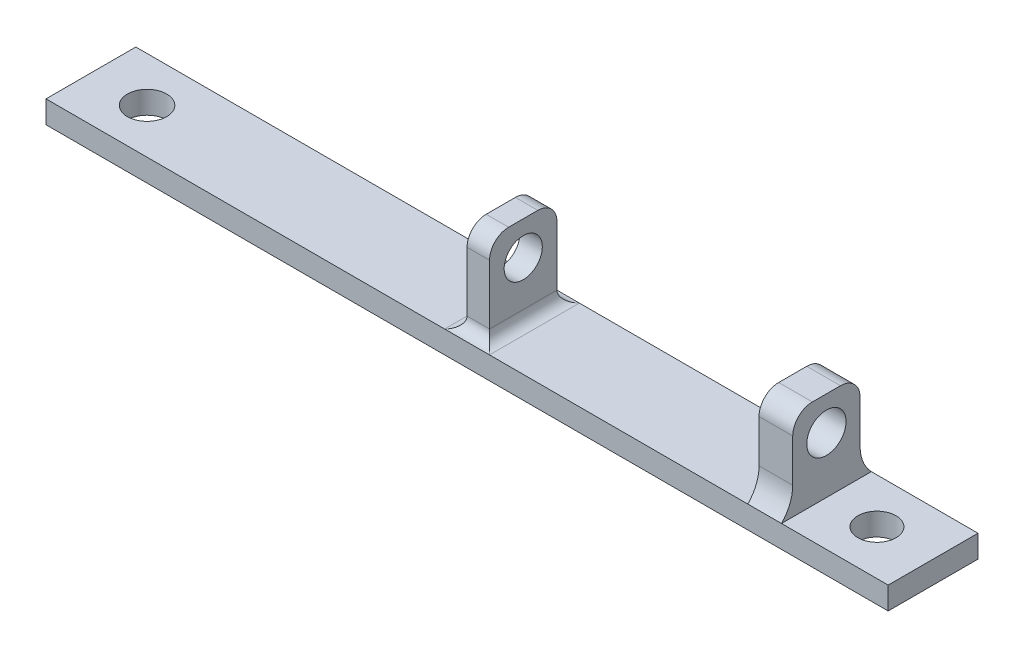
ISO-10303-21;
HEADER;
FILE_DESCRIPTION(('STEP AP214'),'2;1');
FILE_NAME('part.step','',(''),(''),'','','');
FILE_SCHEMA(('AUTOMOTIVE_DESIGN { 1 0 10303 214 1 1 1 1 }'));
ENDSEC;
DATA;
#1=APPLICATION_CONTEXT('core data for automotive mechanical design processes');
#2=APPLICATION_PROTOCOL_DEFINITION('international standard','automotive_design',2000,#1);
#3=PRODUCT_CONTEXT('',#1,'mechanical');
#4=PRODUCT('Part','Part','',(#3));
#5=PRODUCT_RELATED_PRODUCT_CATEGORY('part','',(#4));
#6=PRODUCT_DEFINITION_FORMATION('','',#4);
#7=PRODUCT_DEFINITION_CONTEXT('part definition',#1,'design');
#8=PRODUCT_DEFINITION('design','',#6,#7);
#9=PRODUCT_DEFINITION_SHAPE('','',#8);
#10=(LENGTH_UNIT() NAMED_UNIT(*) SI_UNIT(.MILLI.,.METRE.));
#11=(NAMED_UNIT(*) PLANE_ANGLE_UNIT() SI_UNIT($,.RADIAN.));
#12=(NAMED_UNIT(*) SI_UNIT($,.STERADIAN.) SOLID_ANGLE_UNIT());
#13=UNCERTAINTY_MEASURE_WITH_UNIT(LENGTH_MEASURE(1.E-05),#10,'distance_accuracy_value','');
#14=(GEOMETRIC_REPRESENTATION_CONTEXT(3) GLOBAL_UNCERTAINTY_ASSIGNED_CONTEXT((#13)) GLOBAL_UNIT_ASSIGNED_CONTEXT((#10,
#11,#12)) REPRESENTATION_CONTEXT('',''));
#15=CARTESIAN_POINT('',(0.,0.,0.));
#16=DIRECTION('',(0.,0.,1.));
#17=DIRECTION('',(1.,0.,0.));
#18=AXIS2_PLACEMENT_3D('',#15,#16,#17);
#19=CARTESIAN_POINT('',(0.,2.,0.));
#20=DIRECTION('',(0.,1.,0.));
#21=DIRECTION('',(0.,0.,1.));
#22=AXIS2_PLACEMENT_3D('',#19,#20,#21);
#23=PLANE('',#22);
#24=CARTESIAN_POINT('',(32.5,2.,0.));
#25=DIRECTION('',(0.,1.,0.));
#26=DIRECTION('',(0.,0.,1.));
#27=AXIS2_PLACEMENT_3D('',#24,#25,#26);
#28=CIRCLE('',#27,1.7);
#29=CARTESIAN_POINT('',(32.5,2.,1.7));
#30=VERTEX_POINT('',#29);
#31=EDGE_CURVE('E389',#30,#30,#28,.T.);
#32=ORIENTED_EDGE('',*,*,#31,.F.);
#33=EDGE_LOOP('',(#32));
#34=FACE_BOUND('',#33,.T.);
#35=DIRECTION('',(-1.,0.,0.));
#36=VECTOR('',#35,1.);
#37=CARTESIAN_POINT('',(-37.5,2.,-4.));
#38=LINE('',#37,#36);
#39=CARTESIAN_POINT('',(37.5,2.,-4.));
#40=VERTEX_POINT('',#39);
#41=CARTESIAN_POINT('',(28.,2.,-4.));
#42=VERTEX_POINT('',#41);
#43=EDGE_CURVE('E182',#40,#42,#38,.T.);
#44=ORIENTED_EDGE('',*,*,#43,.T.);
#45=DIRECTION('',(0.,0.,-1.));
#46=VECTOR('',#45,1.);
#47=CARTESIAN_POINT('',(28.,2.,3.));
#48=LINE('',#47,#46);
#49=CARTESIAN_POINT('',(28.,2.,4.));
#50=VERTEX_POINT('',#49);
#51=EDGE_CURVE('E327',#50,#42,#48,.T.);
#52=ORIENTED_EDGE('',*,*,#51,.F.);
#53=DIRECTION('',(1.,0.,0.));
#54=VECTOR('',#53,1.);
#55=CARTESIAN_POINT('',(-37.5,2.,4.));
#56=LINE('',#55,#54);
#57=CARTESIAN_POINT('',(37.5,2.,4.));
#58=VERTEX_POINT('',#57);
#59=EDGE_CURVE('E200',#50,#58,#56,.T.);
#60=ORIENTED_EDGE('',*,*,#59,.T.);
#61=DIRECTION('',(0.,0.,-1.));
#62=VECTOR('',#61,1.);
#63=CARTESIAN_POINT('',(37.5,2.,-4.));
#64=LINE('',#63,#62);
#65=EDGE_CURVE('E198',#58,#40,#64,.T.);
#66=ORIENTED_EDGE('',*,*,#65,.T.);
#67=EDGE_LOOP('',(#44,#52,#60,#66));
#68=FACE_BOUND('',#67,.T.);
#69=ADVANCED_FACE('F43',(#34,#68),#23,.T.);
#70=DIRECTION('',(0.,0.,-1.));
#71=VECTOR('',#70,1.);
#72=CARTESIAN_POINT('',(25.,2.,3.));
#73=LINE('',#72,#71);
#74=CARTESIAN_POINT('',(25.,2.,4.));
#75=VERTEX_POINT('',#74);
#76=CARTESIAN_POINT('',(25.,2.,-4.));
#77=VERTEX_POINT('',#76);
#78=EDGE_CURVE('E247',#75,#77,#73,.T.);
#79=ORIENTED_EDGE('',*,*,#78,.T.);
#80=CARTESIAN_POINT('',(2.,2.,-4.));
#81=VERTEX_POINT('',#80);
#82=EDGE_CURVE('E195',#77,#81,#38,.T.);
#83=ORIENTED_EDGE('',*,*,#82,.T.);
#84=DIRECTION('',(0.,0.,-1.));
#85=VECTOR('',#84,1.);
#86=CARTESIAN_POINT('',(2.,2.,3.));
#87=LINE('',#86,#85);
#88=CARTESIAN_POINT('',(2.,2.,4.));
#89=VERTEX_POINT('',#88);
#90=EDGE_CURVE('E217',#81,#89,#87,.F.);
#91=ORIENTED_EDGE('',*,*,#90,.T.);
#92=EDGE_CURVE('E342',#89,#75,#56,.T.);
#93=ORIENTED_EDGE('',*,*,#92,.T.);
#94=EDGE_LOOP('',(#79,#83,#91,#93));
#95=FACE_BOUND('',#94,.T.);
#96=ADVANCED_FACE('F476',(#95),#23,.T.);
#97=CARTESIAN_POINT('',(-32.5,2.,0.));
#98=DIRECTION('',(0.,1.,0.));
#99=DIRECTION('',(0.,0.,1.));
#100=AXIS2_PLACEMENT_3D('',#97,#98,#99);
#101=CIRCLE('',#100,1.75);
#102=CARTESIAN_POINT('',(-32.5,2.,1.75));
#103=VERTEX_POINT('',#102);
#104=EDGE_CURVE('E352',#103,#103,#101,.T.);
#105=ORIENTED_EDGE('',*,*,#104,.F.);
#106=EDGE_LOOP('',(#105));
#107=FACE_BOUND('',#106,.T.);
#108=CARTESIAN_POINT('',(-37.5,2.,4.));
#109=VERTEX_POINT('',#108);
#110=CARTESIAN_POINT('',(-2.,2.,4.));
#111=VERTEX_POINT('',#110);
#112=EDGE_CURVE('E340',#109,#111,#56,.T.);
#113=ORIENTED_EDGE('',*,*,#112,.T.);
#114=DIRECTION('',(0.,0.,-1.));
#115=VECTOR('',#114,1.);
#116=CARTESIAN_POINT('',(-2.,2.,0.));
#117=LINE('',#116,#115);
#118=CARTESIAN_POINT('',(-2.,2.,-4.));
#119=VERTEX_POINT('',#118);
#120=EDGE_CURVE('E212',#111,#119,#117,.T.);
#121=ORIENTED_EDGE('',*,*,#120,.T.);
#122=CARTESIAN_POINT('',(-37.5,2.,-4.));
#123=VERTEX_POINT('',#122);
#124=EDGE_CURVE('E205',#119,#123,#38,.T.);
#125=ORIENTED_EDGE('',*,*,#124,.T.);
#126=DIRECTION('',(0.,0.,1.));
#127=VECTOR('',#126,1.);
#128=CARTESIAN_POINT('',(-37.5,2.,-4.));
#129=LINE('',#128,#127);
#130=EDGE_CURVE('E193',#123,#109,#129,.T.);
#131=ORIENTED_EDGE('',*,*,#130,.T.);
#132=EDGE_LOOP('',(#113,#121,#125,#131));
#133=FACE_BOUND('',#132,.T.);
#134=ADVANCED_FACE('F479',(#107,#133),#23,.T.);
#135=CARTESIAN_POINT('',(0.,0.,0.));
#136=DIRECTION('',(0.,1.,0.));
#137=DIRECTION('',(0.,0.,1.));
#138=AXIS2_PLACEMENT_3D('',#135,#136,#137);
#139=PLANE('',#138);
#140=DIRECTION('',(0.,0.,-1.));
#141=VECTOR('',#140,1.);
#142=CARTESIAN_POINT('',(37.5,0.,-4.));
#143=LINE('',#142,#141);
#144=CARTESIAN_POINT('',(37.5,0.,4.));
#145=VERTEX_POINT('',#144);
#146=CARTESIAN_POINT('',(37.5,0.,-4.));
#147=VERTEX_POINT('',#146);
#148=EDGE_CURVE('E210',#145,#147,#143,.T.);
#149=ORIENTED_EDGE('',*,*,#148,.F.);
#150=DIRECTION('',(1.,0.,0.));
#151=VECTOR('',#150,1.);
#152=CARTESIAN_POINT('',(-37.5,0.,4.));
#153=LINE('',#152,#151);
#154=CARTESIAN_POINT('',(-37.5,0.,4.));
#155=VERTEX_POINT('',#154);
#156=EDGE_CURVE('E206',#155,#145,#153,.T.);
#157=ORIENTED_EDGE('',*,*,#156,.F.);
#158=DIRECTION('',(0.,0.,1.));
#159=VECTOR('',#158,1.);
#160=CARTESIAN_POINT('',(-37.5,0.,-4.));
#161=LINE('',#160,#159);
#162=CARTESIAN_POINT('',(-37.5,0.,-4.));
#163=VERTEX_POINT('',#162);
#164=EDGE_CURVE('E355',#163,#155,#161,.T.);
#165=ORIENTED_EDGE('',*,*,#164,.F.);
#166=DIRECTION('',(-1.,0.,0.));
#167=VECTOR('',#166,1.);
#168=CARTESIAN_POINT('',(-37.5,0.,-4.));
#169=LINE('',#168,#167);
#170=EDGE_CURVE('E351',#147,#163,#169,.T.);
#171=ORIENTED_EDGE('',*,*,#170,.F.);
#172=EDGE_LOOP('',(#149,#157,#165,#171));
#173=FACE_BOUND('',#172,.T.);
#174=CARTESIAN_POINT('',(-32.5,0.,0.));
#175=DIRECTION('',(0.,1.,0.));
#176=DIRECTION('',(0.,0.,1.));
#177=AXIS2_PLACEMENT_3D('',#174,#175,#176);
#178=CIRCLE('',#177,1.75);
#179=CARTESIAN_POINT('',(-32.5,0.,1.75));
#180=VERTEX_POINT('',#179);
#181=EDGE_CURVE('E385',#180,#180,#178,.T.);
#182=ORIENTED_EDGE('',*,*,#181,.T.);
#183=EDGE_LOOP('',(#182));
#184=FACE_BOUND('',#183,.T.);
#185=CARTESIAN_POINT('',(32.5,0.,0.));
#186=DIRECTION('',(0.,1.,0.));
#187=DIRECTION('',(0.,0.,1.));
#188=AXIS2_PLACEMENT_3D('',#185,#186,#187);
#189=CIRCLE('',#188,1.7);
#190=CARTESIAN_POINT('',(32.5,0.,1.7));
#191=VERTEX_POINT('',#190);
#192=EDGE_CURVE('E393',#191,#191,#189,.T.);
#193=ORIENTED_EDGE('',*,*,#192,.T.);
#194=EDGE_LOOP('',(#193));
#195=FACE_BOUND('',#194,.T.);
#196=ADVANCED_FACE('F370',(#173,#184,#195),#139,.F.);
#197=CARTESIAN_POINT('',(37.5,2.,-4.));
#198=DIRECTION('',(-1.,0.,0.));
#199=DIRECTION('',(0.,0.,1.));
#200=AXIS2_PLACEMENT_3D('',#197,#198,#199);
#201=PLANE('',#200);
#202=ORIENTED_EDGE('',*,*,#148,.T.);
#203=DIRECTION('',(0.,-1.,0.));
#204=VECTOR('',#203,1.);
#205=CARTESIAN_POINT('',(37.5,2.,-4.));
#206=LINE('',#205,#204);
#207=EDGE_CURVE('E186',#40,#147,#206,.T.);
#208=ORIENTED_EDGE('',*,*,#207,.F.);
#209=ORIENTED_EDGE('',*,*,#65,.F.);
#210=DIRECTION('',(0.,-1.,0.));
#211=VECTOR('',#210,1.);
#212=CARTESIAN_POINT('',(37.5,2.,4.));
#213=LINE('',#212,#211);
#214=EDGE_CURVE('E337',#58,#145,#213,.T.);
#215=ORIENTED_EDGE('',*,*,#214,.T.);
#216=EDGE_LOOP('',(#202,#208,#209,#215));
#217=FACE_BOUND('',#216,.T.);
#218=ADVANCED_FACE('F208',(#217),#201,.F.);
#219=CARTESIAN_POINT('',(-37.5,2.,-4.));
#220=DIRECTION('',(0.,0.,1.));
#221=DIRECTION('',(1.,0.,0.));
#222=AXIS2_PLACEMENT_3D('',#219,#220,#221);
#223=PLANE('',#222);
#224=ORIENTED_EDGE('',*,*,#170,.T.);
#225=DIRECTION('',(0.,-1.,0.));
#226=VECTOR('',#225,1.);
#227=CARTESIAN_POINT('',(-37.5,2.,-4.));
#228=LINE('',#227,#226);
#229=EDGE_CURVE('E213',#123,#163,#228,.T.);
#230=ORIENTED_EDGE('',*,*,#229,.F.);
#231=ORIENTED_EDGE('',*,*,#124,.F.);
#232=EDGE_CURVE('E196',#81,#119,#38,.T.);
#233=ORIENTED_EDGE('',*,*,#232,.F.);
#234=ORIENTED_EDGE('',*,*,#82,.F.);
#235=EDGE_CURVE('E190',#42,#77,#38,.T.);
#236=ORIENTED_EDGE('',*,*,#235,.F.);
#237=ORIENTED_EDGE('',*,*,#43,.F.);
#238=ORIENTED_EDGE('',*,*,#207,.T.);
#239=EDGE_LOOP('',(#224,#230,#231,#233,#234,#236,#237,#238));
#240=FACE_BOUND('',#239,.T.);
#241=ADVANCED_FACE('F184',(#240),#223,.F.);
#242=CARTESIAN_POINT('',(-37.5,2.,-4.));
#243=DIRECTION('',(1.,0.,0.));
#244=DIRECTION('',(0.,0.,-1.));
#245=AXIS2_PLACEMENT_3D('',#242,#243,#244);
#246=PLANE('',#245);
#247=ORIENTED_EDGE('',*,*,#164,.T.);
#248=DIRECTION('',(0.,-1.,0.));
#249=VECTOR('',#248,1.);
#250=CARTESIAN_POINT('',(-37.5,2.,4.));
#251=LINE('',#250,#249);
#252=EDGE_CURVE('E220',#109,#155,#251,.T.);
#253=ORIENTED_EDGE('',*,*,#252,.F.);
#254=ORIENTED_EDGE('',*,*,#130,.F.);
#255=ORIENTED_EDGE('',*,*,#229,.T.);
#256=EDGE_LOOP('',(#247,#253,#254,#255));
#257=FACE_BOUND('',#256,.T.);
#258=ADVANCED_FACE('F374',(#257),#246,.F.);
#259=CARTESIAN_POINT('',(-37.5,2.,4.));
#260=DIRECTION('',(0.,0.,-1.));
#261=DIRECTION('',(-1.,0.,0.));
#262=AXIS2_PLACEMENT_3D('',#259,#260,#261);
#263=PLANE('',#262);
#264=ORIENTED_EDGE('',*,*,#156,.T.);
#265=ORIENTED_EDGE('',*,*,#214,.F.);
#266=ORIENTED_EDGE('',*,*,#59,.F.);
#267=EDGE_CURVE('E335',#75,#50,#56,.T.);
#268=ORIENTED_EDGE('',*,*,#267,.F.);
#269=ORIENTED_EDGE('',*,*,#92,.F.);
#270=EDGE_CURVE('E344',#111,#89,#56,.T.);
#271=ORIENTED_EDGE('',*,*,#270,.F.);
#272=ORIENTED_EDGE('',*,*,#112,.F.);
#273=ORIENTED_EDGE('',*,*,#252,.T.);
#274=EDGE_LOOP('',(#264,#265,#266,#268,#269,#271,#272,#273));
#275=FACE_BOUND('',#274,.T.);
#276=ADVANCED_FACE('F333',(#275),#263,.F.);
#277=CARTESIAN_POINT('',(-32.5,2.,0.));
#278=DIRECTION('',(0.,-1.,0.));
#279=DIRECTION('',(0.,0.,-1.));
#280=AXIS2_PLACEMENT_3D('',#277,#278,#279);
#281=CYLINDRICAL_SURFACE('',#280,1.75);
#282=ORIENTED_EDGE('',*,*,#104,.T.);
#283=EDGE_LOOP('',(#282));
#284=FACE_BOUND('',#283,.T.);
#285=ORIENTED_EDGE('',*,*,#181,.F.);
#286=EDGE_LOOP('',(#285));
#287=FACE_BOUND('',#286,.T.);
#288=ADVANCED_FACE('F585',(#284,#287),#281,.F.);
#289=CARTESIAN_POINT('',(32.5,2.,0.));
#290=DIRECTION('',(0.,-1.,0.));
#291=DIRECTION('',(0.,0.,-1.));
#292=AXIS2_PLACEMENT_3D('',#289,#290,#291);
#293=CYLINDRICAL_SURFACE('',#292,1.7);
#294=ORIENTED_EDGE('',*,*,#31,.T.);
#295=EDGE_LOOP('',(#294));
#296=FACE_BOUND('',#295,.T.);
#297=ORIENTED_EDGE('',*,*,#192,.F.);
#298=EDGE_LOOP('',(#297));
#299=FACE_BOUND('',#298,.T.);
#300=ADVANCED_FACE('F583',(#296,#299),#293,.F.);
#301=CARTESIAN_POINT('',(-1.,10.,-3.));
#302=DIRECTION('',(0.,0.,-1.));
#303=DIRECTION('',(0.,1.,0.));
#304=AXIS2_PLACEMENT_3D('',#301,#302,#303);
#305=PLANE('',#304);
#306=DIRECTION('',(0.,1.,0.));
#307=VECTOR('',#306,1.);
#308=CARTESIAN_POINT('',(-1.,10.,-3.));
#309=LINE('',#308,#307);
#310=CARTESIAN_POINT('',(-1.,3.,-3.));
#311=VERTEX_POINT('',#310);
#312=CARTESIAN_POINT('',(-1.,8.3,-3.));
#313=VERTEX_POINT('',#312);
#314=EDGE_CURVE('E404',#311,#313,#309,.T.);
#315=ORIENTED_EDGE('',*,*,#314,.T.);
#316=DIRECTION('',(1.,0.,0.));
#317=VECTOR('',#316,1.);
#318=CARTESIAN_POINT('',(-1.,8.3,-3.));
#319=LINE('',#318,#317);
#320=CARTESIAN_POINT('',(1.,8.3,-3.));
#321=VERTEX_POINT('',#320);
#322=EDGE_CURVE('E241',#313,#321,#319,.T.);
#323=ORIENTED_EDGE('',*,*,#322,.T.);
#324=DIRECTION('',(0.,1.,0.));
#325=VECTOR('',#324,1.);
#326=CARTESIAN_POINT('',(1.,10.,-3.));
#327=LINE('',#326,#325);
#328=CARTESIAN_POINT('',(1.,3.,-3.));
#329=VERTEX_POINT('',#328);
#330=EDGE_CURVE('E419',#329,#321,#327,.T.);
#331=ORIENTED_EDGE('',*,*,#330,.F.);
#332=DIRECTION('',(1.,0.,0.));
#333=VECTOR('',#332,1.);
#334=CARTESIAN_POINT('',(-1.,3.,-3.));
#335=LINE('',#334,#333);
#336=EDGE_CURVE('E226',#329,#311,#335,.F.);
#337=ORIENTED_EDGE('',*,*,#336,.T.);
#338=EDGE_LOOP('',(#315,#323,#331,#337));
#339=FACE_BOUND('',#338,.T.);
#340=ADVANCED_FACE('F545',(#339),#305,.T.);
#341=CARTESIAN_POINT('',(-1.,10.,3.));
#342=DIRECTION('',(0.,0.,1.));
#343=DIRECTION('',(0.,-1.,0.));
#344=AXIS2_PLACEMENT_3D('',#341,#342,#343);
#345=PLANE('',#344);
#346=DIRECTION('',(0.,-1.,0.));
#347=VECTOR('',#346,1.);
#348=CARTESIAN_POINT('',(1.,10.,3.));
#349=LINE('',#348,#347);
#350=CARTESIAN_POINT('',(1.,8.3,3.));
#351=VERTEX_POINT('',#350);
#352=CARTESIAN_POINT('',(1.,3.,3.));
#353=VERTEX_POINT('',#352);
#354=EDGE_CURVE('E412',#351,#353,#349,.T.);
#355=ORIENTED_EDGE('',*,*,#354,.F.);
#356=DIRECTION('',(1.,0.,0.));
#357=VECTOR('',#356,1.);
#358=CARTESIAN_POINT('',(-1.,8.3,3.));
#359=LINE('',#358,#357);
#360=CARTESIAN_POINT('',(-1.,8.3,3.));
#361=VERTEX_POINT('',#360);
#362=EDGE_CURVE('E281',#351,#361,#359,.F.);
#363=ORIENTED_EDGE('',*,*,#362,.T.);
#364=DIRECTION('',(0.,-1.,0.));
#365=VECTOR('',#364,1.);
#366=CARTESIAN_POINT('',(-1.,10.,3.));
#367=LINE('',#366,#365);
#368=CARTESIAN_POINT('',(-1.,3.,3.));
#369=VERTEX_POINT('',#368);
#370=EDGE_CURVE('E397',#361,#369,#367,.T.);
#371=ORIENTED_EDGE('',*,*,#370,.T.);
#372=DIRECTION('',(1.,0.,0.));
#373=VECTOR('',#372,1.);
#374=CARTESIAN_POINT('',(1.,3.,3.));
#375=LINE('',#374,#373);
#376=EDGE_CURVE('E233',#369,#353,#375,.T.);
#377=ORIENTED_EDGE('',*,*,#376,.T.);
#378=EDGE_LOOP('',(#355,#363,#371,#377));
#379=FACE_BOUND('',#378,.T.);
#380=ADVANCED_FACE('F562',(#379),#345,.T.);
#381=CARTESIAN_POINT('',(-1.,10.,3.));
#382=DIRECTION('',(0.,1.,0.));
#383=DIRECTION('',(0.,0.,1.));
#384=AXIS2_PLACEMENT_3D('',#381,#382,#383);
#385=PLANE('',#384);
#386=DIRECTION('',(0.,0.,1.));
#387=VECTOR('',#386,1.);
#388=CARTESIAN_POINT('',(1.,10.,3.));
#389=LINE('',#388,#387);
#390=CARTESIAN_POINT('',(1.,10.,-1.3));
#391=VERTEX_POINT('',#390);
#392=CARTESIAN_POINT('',(1.,10.,1.3));
#393=VERTEX_POINT('',#392);
#394=EDGE_CURVE('E415',#391,#393,#389,.T.);
#395=ORIENTED_EDGE('',*,*,#394,.F.);
#396=DIRECTION('',(1.,0.,0.));
#397=VECTOR('',#396,1.);
#398=CARTESIAN_POINT('',(-1.,10.,-1.3));
#399=LINE('',#398,#397);
#400=CARTESIAN_POINT('',(-1.,10.,-1.3));
#401=VERTEX_POINT('',#400);
#402=EDGE_CURVE('E272',#391,#401,#399,.F.);
#403=ORIENTED_EDGE('',*,*,#402,.T.);
#404=DIRECTION('',(0.,0.,1.));
#405=VECTOR('',#404,1.);
#406=CARTESIAN_POINT('',(-1.,10.,3.));
#407=LINE('',#406,#405);
#408=CARTESIAN_POINT('',(-1.,10.,1.3));
#409=VERTEX_POINT('',#408);
#410=EDGE_CURVE('E400',#401,#409,#407,.T.);
#411=ORIENTED_EDGE('',*,*,#410,.T.);
#412=DIRECTION('',(1.,0.,0.));
#413=VECTOR('',#412,1.);
#414=CARTESIAN_POINT('',(-1.,10.,1.3));
#415=LINE('',#414,#413);
#416=EDGE_CURVE('E268',#409,#393,#415,.T.);
#417=ORIENTED_EDGE('',*,*,#416,.T.);
#418=EDGE_LOOP('',(#395,#403,#411,#417));
#419=FACE_BOUND('',#418,.T.);
#420=ADVANCED_FACE('F554',(#419),#385,.T.);
#421=CARTESIAN_POINT('',(-1.,0.,0.));
#422=DIRECTION('',(1.,0.,0.));
#423=DIRECTION('',(0.,0.,-1.));
#424=AXIS2_PLACEMENT_3D('',#421,#422,#423);
#425=PLANE('',#424);
#426=CARTESIAN_POINT('',(-1.,7.,0.));
#427=DIRECTION('',(1.,0.,0.));
#428=DIRECTION('',(0.,0.,-1.));
#429=AXIS2_PLACEMENT_3D('',#426,#427,#428);
#430=CIRCLE('',#429,1.7);
#431=CARTESIAN_POINT('',(-1.,7.,-1.7));
#432=VERTEX_POINT('',#431);
#433=EDGE_CURVE('E408',#432,#432,#430,.T.);
#434=ORIENTED_EDGE('',*,*,#433,.T.);
#435=EDGE_LOOP('',(#434));
#436=FACE_BOUND('',#435,.T.);
#437=ORIENTED_EDGE('',*,*,#410,.F.);
#438=CARTESIAN_POINT('',(-1.,8.3,-1.3));
#439=DIRECTION('',(1.,0.,0.));
#440=DIRECTION('',(0.,0.,-1.));
#441=AXIS2_PLACEMENT_3D('',#438,#439,#440);
#442=CIRCLE('',#441,1.7);
#443=EDGE_CURVE('E278',#401,#313,#442,.F.);
#444=ORIENTED_EDGE('',*,*,#443,.T.);
#445=ORIENTED_EDGE('',*,*,#314,.F.);
#446=DIRECTION('',(0.,0.,-1.));
#447=VECTOR('',#446,1.);
#448=CARTESIAN_POINT('',(-1.,3.,0.));
#449=LINE('',#448,#447);
#450=EDGE_CURVE('E237',#311,#369,#449,.F.);
#451=ORIENTED_EDGE('',*,*,#450,.T.);
#452=ORIENTED_EDGE('',*,*,#370,.F.);
#453=CARTESIAN_POINT('',(-1.,8.3,1.3));
#454=DIRECTION('',(1.,0.,0.));
#455=DIRECTION('',(0.,0.,-1.));
#456=AXIS2_PLACEMENT_3D('',#453,#454,#455);
#457=CIRCLE('',#456,1.7);
#458=EDGE_CURVE('E275',#361,#409,#457,.F.);
#459=ORIENTED_EDGE('',*,*,#458,.T.);
#460=EDGE_LOOP('',(#437,#444,#445,#451,#452,#459));
#461=FACE_BOUND('',#460,.T.);
#462=ADVANCED_FACE('F565',(#436,#461),#425,.F.);
#463=CARTESIAN_POINT('',(-1.,7.,0.));
#464=DIRECTION('',(1.,0.,0.));
#465=DIRECTION('',(0.,0.,-1.));
#466=AXIS2_PLACEMENT_3D('',#463,#464,#465);
#467=CYLINDRICAL_SURFACE('',#466,1.7);
#468=ORIENTED_EDGE('',*,*,#433,.F.);
#469=EDGE_LOOP('',(#468));
#470=FACE_BOUND('',#469,.T.);
#471=CARTESIAN_POINT('',(1.,7.,0.));
#472=DIRECTION('',(1.,0.,0.));
#473=DIRECTION('',(0.,0.,-1.));
#474=AXIS2_PLACEMENT_3D('',#471,#472,#473);
#475=CIRCLE('',#474,1.7);
#476=CARTESIAN_POINT('',(1.,7.,-1.7));
#477=VERTEX_POINT('',#476);
#478=EDGE_CURVE('E258',#477,#477,#475,.T.);
#479=ORIENTED_EDGE('',*,*,#478,.T.);
#480=EDGE_LOOP('',(#479));
#481=FACE_BOUND('',#480,.T.);
#482=ADVANCED_FACE('F567',(#470,#481),#467,.F.);
#483=CARTESIAN_POINT('',(1.,0.,0.));
#484=DIRECTION('',(1.,0.,0.));
#485=DIRECTION('',(0.,0.,-1.));
#486=AXIS2_PLACEMENT_3D('',#483,#484,#485);
#487=PLANE('',#486);
#488=ORIENTED_EDGE('',*,*,#330,.T.);
#489=CARTESIAN_POINT('',(1.,8.3,-1.3));
#490=DIRECTION('',(1.,0.,0.));
#491=DIRECTION('',(0.,0.,-1.));
#492=AXIS2_PLACEMENT_3D('',#489,#490,#491);
#493=CIRCLE('',#492,1.7);
#494=EDGE_CURVE('E265',#321,#391,#493,.T.);
#495=ORIENTED_EDGE('',*,*,#494,.T.);
#496=ORIENTED_EDGE('',*,*,#394,.T.);
#497=CARTESIAN_POINT('',(1.,8.3,1.3));
#498=DIRECTION('',(1.,0.,0.));
#499=DIRECTION('',(0.,0.,-1.));
#500=AXIS2_PLACEMENT_3D('',#497,#498,#499);
#501=CIRCLE('',#500,1.7);
#502=EDGE_CURVE('E262',#393,#351,#501,.T.);
#503=ORIENTED_EDGE('',*,*,#502,.T.);
#504=ORIENTED_EDGE('',*,*,#354,.T.);
#505=DIRECTION('',(0.,0.,-1.));
#506=VECTOR('',#505,1.);
#507=CARTESIAN_POINT('',(1.,3.,-3.));
#508=LINE('',#507,#506);
#509=EDGE_CURVE('E230',#353,#329,#508,.T.);
#510=ORIENTED_EDGE('',*,*,#509,.T.);
#511=EDGE_LOOP('',(#488,#495,#496,#503,#504,#510));
#512=FACE_BOUND('',#511,.T.);
#513=ORIENTED_EDGE('',*,*,#478,.F.);
#514=EDGE_LOOP('',(#513));
#515=FACE_BOUND('',#514,.T.);
#516=ADVANCED_FACE('F541',(#512,#515),#487,.T.);
#517=CARTESIAN_POINT('',(-1.,3.,4.));
#518=DIRECTION('',(-1.,0.,0.));
#519=DIRECTION('',(0.,0.,1.));
#520=AXIS2_PLACEMENT_3D('',#517,#518,#519);
#521=CYLINDRICAL_SURFACE('',#520,1.);
#522=CARTESIAN_POINT('',(2.,3.,4.));
#523=DIRECTION('',(-0.707106781186547,0.,0.707106781186547));
#524=DIRECTION('',(-0.707106781186547,0.,-0.707106781186547));
#525=AXIS2_PLACEMENT_3D('',#522,#523,#524);
#526=ELLIPSE('',#525,1.41421356237309,1.);
#527=EDGE_CURVE('E250',#353,#89,#526,.T.);
#528=ORIENTED_EDGE('',*,*,#527,.F.);
#529=ORIENTED_EDGE('',*,*,#376,.F.);
#530=CARTESIAN_POINT('',(-2.,3.,4.));
#531=DIRECTION('',(-0.707106781186547,0.,-0.707106781186547));
#532=DIRECTION('',(0.707106781186547,0.,-0.707106781186547));
#533=AXIS2_PLACEMENT_3D('',#530,#531,#532);
#534=ELLIPSE('',#533,1.41421356237309,1.);
#535=EDGE_CURVE('E254',#111,#369,#534,.F.);
#536=ORIENTED_EDGE('',*,*,#535,.F.);
#537=ORIENTED_EDGE('',*,*,#270,.T.);
#538=EDGE_LOOP('',(#528,#529,#536,#537));
#539=FACE_BOUND('',#538,.T.);
#540=ADVANCED_FACE('F501',(#539),#521,.F.);
#541=CARTESIAN_POINT('',(-2.,3.,0.));
#542=DIRECTION('',(0.,0.,-1.));
#543=DIRECTION('',(-1.,0.,0.));
#544=AXIS2_PLACEMENT_3D('',#541,#542,#543);
#545=CYLINDRICAL_SURFACE('',#544,1.);
#546=ORIENTED_EDGE('',*,*,#535,.T.);
#547=ORIENTED_EDGE('',*,*,#450,.F.);
#548=CARTESIAN_POINT('',(-2.,3.,-4.));
#549=DIRECTION('',(0.707106781186547,0.,-0.707106781186547));
#550=DIRECTION('',(-0.707106781186547,0.,-0.707106781186547));
#551=AXIS2_PLACEMENT_3D('',#548,#549,#550);
#552=ELLIPSE('',#551,1.41421356237309,1.);
#553=EDGE_CURVE('E246',#119,#311,#552,.F.);
#554=ORIENTED_EDGE('',*,*,#553,.F.);
#555=ORIENTED_EDGE('',*,*,#120,.F.);
#556=EDGE_LOOP('',(#546,#547,#554,#555));
#557=FACE_BOUND('',#556,.T.);
#558=ADVANCED_FACE('F505',(#557),#545,.F.);
#559=CARTESIAN_POINT('',(2.,3.,0.));
#560=DIRECTION('',(0.,0.,1.));
#561=DIRECTION('',(1.,0.,0.));
#562=AXIS2_PLACEMENT_3D('',#559,#560,#561);
#563=CYLINDRICAL_SURFACE('',#562,1.);
#564=ORIENTED_EDGE('',*,*,#527,.T.);
#565=ORIENTED_EDGE('',*,*,#90,.F.);
#566=CARTESIAN_POINT('',(2.,3.,-4.));
#567=DIRECTION('',(0.707106781186547,0.,0.707106781186547));
#568=DIRECTION('',(-0.707106781186547,0.,0.707106781186547));
#569=AXIS2_PLACEMENT_3D('',#566,#567,#568);
#570=ELLIPSE('',#569,1.41421356237309,1.);
#571=EDGE_CURVE('E242',#329,#81,#570,.T.);
#572=ORIENTED_EDGE('',*,*,#571,.F.);
#573=ORIENTED_EDGE('',*,*,#509,.F.);
#574=EDGE_LOOP('',(#564,#565,#572,#573));
#575=FACE_BOUND('',#574,.T.);
#576=ADVANCED_FACE('F537',(#575),#563,.F.);
#577=CARTESIAN_POINT('',(0.,3.,-4.));
#578=DIRECTION('',(-1.,0.,0.));
#579=DIRECTION('',(0.,0.,1.));
#580=AXIS2_PLACEMENT_3D('',#577,#578,#579);
#581=CYLINDRICAL_SURFACE('',#580,1.);
#582=ORIENTED_EDGE('',*,*,#553,.T.);
#583=ORIENTED_EDGE('',*,*,#336,.F.);
#584=ORIENTED_EDGE('',*,*,#571,.T.);
#585=ORIENTED_EDGE('',*,*,#232,.T.);
#586=EDGE_LOOP('',(#582,#583,#584,#585));
#587=FACE_BOUND('',#586,.T.);
#588=ADVANCED_FACE('F509',(#587),#581,.F.);
#589=CARTESIAN_POINT('',(-1.,8.3,-1.3));
#590=DIRECTION('',(1.,0.,0.));
#591=DIRECTION('',(0.,0.,-1.));
#592=AXIS2_PLACEMENT_3D('',#589,#590,#591);
#593=CYLINDRICAL_SURFACE('',#592,1.7);
#594=ORIENTED_EDGE('',*,*,#443,.F.);
#595=ORIENTED_EDGE('',*,*,#402,.F.);
#596=ORIENTED_EDGE('',*,*,#494,.F.);
#597=ORIENTED_EDGE('',*,*,#322,.F.);
#598=EDGE_LOOP('',(#594,#595,#596,#597));
#599=FACE_BOUND('',#598,.T.);
#600=ADVANCED_FACE('F550',(#599),#593,.T.);
#601=CARTESIAN_POINT('',(-1.,8.3,1.3));
#602=DIRECTION('',(1.,0.,0.));
#603=DIRECTION('',(0.,0.,-1.));
#604=AXIS2_PLACEMENT_3D('',#601,#602,#603);
#605=CYLINDRICAL_SURFACE('',#604,1.7);
#606=ORIENTED_EDGE('',*,*,#458,.F.);
#607=ORIENTED_EDGE('',*,*,#362,.F.);
#608=ORIENTED_EDGE('',*,*,#502,.F.);
#609=ORIENTED_EDGE('',*,*,#416,.F.);
#610=EDGE_LOOP('',(#606,#607,#608,#609));
#611=FACE_BOUND('',#610,.T.);
#612=ADVANCED_FACE('F559',(#611),#605,.T.);
#613=CARTESIAN_POINT('',(25.,2.,-3.));
#614=DIRECTION('',(0.,0.,-1.));
#615=DIRECTION('',(-1.,0.,0.));
#616=AXIS2_PLACEMENT_3D('',#613,#614,#615);
#617=PLANE('',#616);
#618=DIRECTION('',(0.,1.,0.));
#619=VECTOR('',#618,1.);
#620=CARTESIAN_POINT('',(28.,2.,-3.));
#621=LINE('',#620,#619);
#622=CARTESIAN_POINT('',(28.,4.44948974278318,-3.));
#623=VERTEX_POINT('',#622);
#624=CARTESIAN_POINT('',(28.,8.25,-3.));
#625=VERTEX_POINT('',#624);
#626=EDGE_CURVE('E446',#623,#625,#621,.T.);
#627=ORIENTED_EDGE('',*,*,#626,.F.);
#628=DIRECTION('',(-1.,0.,0.));
#629=VECTOR('',#628,1.);
#630=CARTESIAN_POINT('',(25.,4.44948974278318,-3.));
#631=LINE('',#630,#629);
#632=CARTESIAN_POINT('',(25.,4.44948974278318,-3.));
#633=VERTEX_POINT('',#632);
#634=EDGE_CURVE('E311',#623,#633,#631,.T.);
#635=ORIENTED_EDGE('',*,*,#634,.T.);
#636=DIRECTION('',(0.,1.,0.));
#637=VECTOR('',#636,1.);
#638=CARTESIAN_POINT('',(25.,2.,-3.));
#639=LINE('',#638,#637);
#640=CARTESIAN_POINT('',(25.,8.25,-3.));
#641=VERTEX_POINT('',#640);
#642=EDGE_CURVE('E435',#633,#641,#639,.T.);
#643=ORIENTED_EDGE('',*,*,#642,.T.);
#644=DIRECTION('',(1.,0.,0.));
#645=VECTOR('',#644,1.);
#646=CARTESIAN_POINT('',(25.,8.25,-3.));
#647=LINE('',#646,#645);
#648=EDGE_CURVE('E284',#641,#625,#647,.T.);
#649=ORIENTED_EDGE('',*,*,#648,.T.);
#650=EDGE_LOOP('',(#627,#635,#643,#649));
#651=FACE_BOUND('',#650,.T.);
#652=ADVANCED_FACE('F519',(#651),#617,.T.);
#653=CARTESIAN_POINT('',(25.,2.,3.));
#654=DIRECTION('',(0.,0.,1.));
#655=DIRECTION('',(1.,0.,0.));
#656=AXIS2_PLACEMENT_3D('',#653,#654,#655);
#657=PLANE('',#656);
#658=DIRECTION('',(0.,-1.,0.));
#659=VECTOR('',#658,1.);
#660=CARTESIAN_POINT('',(25.,2.,3.));
#661=LINE('',#660,#659);
#662=CARTESIAN_POINT('',(25.,8.25,3.));
#663=VERTEX_POINT('',#662);
#664=CARTESIAN_POINT('',(25.,4.44948974278318,3.));
#665=VERTEX_POINT('',#664);
#666=EDGE_CURVE('E428',#663,#665,#661,.T.);
#667=ORIENTED_EDGE('',*,*,#666,.T.);
#668=DIRECTION('',(1.,0.,0.));
#669=VECTOR('',#668,1.);
#670=CARTESIAN_POINT('',(28.,4.44948974278318,3.));
#671=LINE('',#670,#669);
#672=CARTESIAN_POINT('',(28.,4.44948974278318,3.));
#673=VERTEX_POINT('',#672);
#674=EDGE_CURVE('E314',#665,#673,#671,.T.);
#675=ORIENTED_EDGE('',*,*,#674,.T.);
#676=DIRECTION('',(0.,-1.,0.));
#677=VECTOR('',#676,1.);
#678=CARTESIAN_POINT('',(28.,2.,3.));
#679=LINE('',#678,#677);
#680=CARTESIAN_POINT('',(28.,8.25,3.));
#681=VERTEX_POINT('',#680);
#682=EDGE_CURVE('E330',#681,#673,#679,.T.);
#683=ORIENTED_EDGE('',*,*,#682,.F.);
#684=DIRECTION('',(1.,0.,0.));
#685=VECTOR('',#684,1.);
#686=CARTESIAN_POINT('',(25.,8.25,3.));
#687=LINE('',#686,#685);
#688=EDGE_CURVE('E308',#681,#663,#687,.F.);
#689=ORIENTED_EDGE('',*,*,#688,.T.);
#690=EDGE_LOOP('',(#667,#675,#683,#689));
#691=FACE_BOUND('',#690,.T.);
#692=ADVANCED_FACE('F534',(#691),#657,.T.);
#693=CARTESIAN_POINT('',(25.,10.,3.));
#694=DIRECTION('',(0.,1.,0.));
#695=DIRECTION('',(0.,0.,1.));
#696=AXIS2_PLACEMENT_3D('',#693,#694,#695);
#697=PLANE('',#696);
#698=DIRECTION('',(0.,0.,1.));
#699=VECTOR('',#698,1.);
#700=CARTESIAN_POINT('',(28.,10.,3.));
#701=LINE('',#700,#699);
#702=CARTESIAN_POINT('',(28.,10.,-1.25));
#703=VERTEX_POINT('',#702);
#704=CARTESIAN_POINT('',(28.,10.,1.25));
#705=VERTEX_POINT('',#704);
#706=EDGE_CURVE('E442',#703,#705,#701,.T.);
#707=ORIENTED_EDGE('',*,*,#706,.F.);
#708=DIRECTION('',(1.,0.,0.));
#709=VECTOR('',#708,1.);
#710=CARTESIAN_POINT('',(25.,10.,-1.25));
#711=LINE('',#710,#709);
#712=CARTESIAN_POINT('',(25.,10.,-1.25));
#713=VERTEX_POINT('',#712);
#714=EDGE_CURVE('E298',#703,#713,#711,.F.);
#715=ORIENTED_EDGE('',*,*,#714,.T.);
#716=DIRECTION('',(0.,0.,1.));
#717=VECTOR('',#716,1.);
#718=CARTESIAN_POINT('',(25.,10.,3.));
#719=LINE('',#718,#717);
#720=CARTESIAN_POINT('',(25.,10.,1.25));
#721=VERTEX_POINT('',#720);
#722=EDGE_CURVE('E431',#713,#721,#719,.T.);
#723=ORIENTED_EDGE('',*,*,#722,.T.);
#724=DIRECTION('',(1.,0.,0.));
#725=VECTOR('',#724,1.);
#726=CARTESIAN_POINT('',(25.,10.,1.25));
#727=LINE('',#726,#725);
#728=EDGE_CURVE('E294',#721,#705,#727,.T.);
#729=ORIENTED_EDGE('',*,*,#728,.T.);
#730=EDGE_LOOP('',(#707,#715,#723,#729));
#731=FACE_BOUND('',#730,.T.);
#732=ADVANCED_FACE('F471',(#731),#697,.T.);
#733=CARTESIAN_POINT('',(25.,0.,0.));
#734=DIRECTION('',(-1.,0.,0.));
#735=DIRECTION('',(0.,0.,1.));
#736=AXIS2_PLACEMENT_3D('',#733,#734,#735);
#737=PLANE('',#736);
#738=CARTESIAN_POINT('',(25.,7.,0.));
#739=DIRECTION('',(1.,0.,0.));
#740=DIRECTION('',(0.,0.,-1.));
#741=AXIS2_PLACEMENT_3D('',#738,#739,#740);
#742=CIRCLE('',#741,1.75);
#743=CARTESIAN_POINT('',(25.,7.,-1.75));
#744=VERTEX_POINT('',#743);
#745=EDGE_CURVE('E449',#744,#744,#742,.T.);
#746=ORIENTED_EDGE('',*,*,#745,.T.);
#747=EDGE_LOOP('',(#746));
#748=FACE_BOUND('',#747,.T.);
#749=ORIENTED_EDGE('',*,*,#722,.F.);
#750=CARTESIAN_POINT('',(25.,8.25,-1.25));
#751=DIRECTION('',(-1.,0.,0.));
#752=DIRECTION('',(0.,0.,1.));
#753=AXIS2_PLACEMENT_3D('',#750,#751,#752);
#754=CIRCLE('',#753,1.75);
#755=EDGE_CURVE('E304',#713,#641,#754,.T.);
#756=ORIENTED_EDGE('',*,*,#755,.T.);
#757=ORIENTED_EDGE('',*,*,#642,.F.);
#758=CARTESIAN_POINT('',(25.,4.44948974278318,-6.5));
#759=DIRECTION('',(-1.,0.,0.));
#760=DIRECTION('',(0.,0.,1.));
#761=AXIS2_PLACEMENT_3D('',#758,#759,#760);
#762=CIRCLE('',#761,3.5);
#763=EDGE_CURVE('E320',#633,#77,#762,.F.);
#764=ORIENTED_EDGE('',*,*,#763,.T.);
#765=ORIENTED_EDGE('',*,*,#78,.F.);
#766=CARTESIAN_POINT('',(25.,4.44948974278318,6.5));
#767=DIRECTION('',(-1.,0.,0.));
#768=DIRECTION('',(0.,0.,1.));
#769=AXIS2_PLACEMENT_3D('',#766,#767,#768);
#770=CIRCLE('',#769,3.5);
#771=EDGE_CURVE('E11',#75,#665,#770,.F.);
#772=ORIENTED_EDGE('',*,*,#771,.T.);
#773=ORIENTED_EDGE('',*,*,#666,.F.);
#774=CARTESIAN_POINT('',(25.,8.25,1.25));
#775=DIRECTION('',(-1.,0.,0.));
#776=DIRECTION('',(0.,0.,1.));
#777=AXIS2_PLACEMENT_3D('',#774,#775,#776);
#778=CIRCLE('',#777,1.75);
#779=EDGE_CURVE('E301',#663,#721,#778,.T.);
#780=ORIENTED_EDGE('',*,*,#779,.T.);
#781=EDGE_LOOP('',(#749,#756,#757,#764,#765,#772,#773,#780));
#782=FACE_BOUND('',#781,.T.);
#783=ADVANCED_FACE('F462',(#748,#782),#737,.T.);
#784=CARTESIAN_POINT('',(28.,0.,0.));
#785=DIRECTION('',(-1.,0.,0.));
#786=DIRECTION('',(0.,0.,1.));
#787=AXIS2_PLACEMENT_3D('',#784,#785,#786);
#788=PLANE('',#787);
#789=CARTESIAN_POINT('',(28.,7.,0.));
#790=DIRECTION('',(1.,0.,0.));
#791=DIRECTION('',(0.,0.,-1.));
#792=AXIS2_PLACEMENT_3D('',#789,#790,#791);
#793=CIRCLE('',#792,1.75);
#794=CARTESIAN_POINT('',(28.,7.,-1.75));
#795=VERTEX_POINT('',#794);
#796=EDGE_CURVE('E453',#795,#795,#793,.T.);
#797=ORIENTED_EDGE('',*,*,#796,.F.);
#798=EDGE_LOOP('',(#797));
#799=FACE_BOUND('',#798,.T.);
#800=ORIENTED_EDGE('',*,*,#51,.T.);
#801=CARTESIAN_POINT('',(28.,4.44948974278318,-6.5));
#802=DIRECTION('',(-1.,0.,0.));
#803=DIRECTION('',(0.,0.,1.));
#804=AXIS2_PLACEMENT_3D('',#801,#802,#803);
#805=CIRCLE('',#804,3.5);
#806=EDGE_CURVE('E317',#42,#623,#805,.T.);
#807=ORIENTED_EDGE('',*,*,#806,.T.);
#808=ORIENTED_EDGE('',*,*,#626,.T.);
#809=CARTESIAN_POINT('',(28.,8.25,-1.25));
#810=DIRECTION('',(-1.,0.,0.));
#811=DIRECTION('',(0.,0.,1.));
#812=AXIS2_PLACEMENT_3D('',#809,#810,#811);
#813=CIRCLE('',#812,1.75);
#814=EDGE_CURVE('E291',#625,#703,#813,.F.);
#815=ORIENTED_EDGE('',*,*,#814,.T.);
#816=ORIENTED_EDGE('',*,*,#706,.T.);
#817=CARTESIAN_POINT('',(28.,8.25,1.25));
#818=DIRECTION('',(-1.,0.,0.));
#819=DIRECTION('',(0.,0.,1.));
#820=AXIS2_PLACEMENT_3D('',#817,#818,#819);
#821=CIRCLE('',#820,1.75);
#822=EDGE_CURVE('E288',#705,#681,#821,.F.);
#823=ORIENTED_EDGE('',*,*,#822,.T.);
#824=ORIENTED_EDGE('',*,*,#682,.T.);
#825=CARTESIAN_POINT('',(28.,4.44948974278318,6.5));
#826=DIRECTION('',(-1.,0.,0.));
#827=DIRECTION('',(0.,0.,1.));
#828=AXIS2_PLACEMENT_3D('',#825,#826,#827);
#829=CIRCLE('',#828,3.5);
#830=EDGE_CURVE('E52',#673,#50,#829,.T.);
#831=ORIENTED_EDGE('',*,*,#830,.T.);
#832=EDGE_LOOP('',(#800,#807,#808,#815,#816,#823,#824,#831));
#833=FACE_BOUND('',#832,.T.);
#834=ADVANCED_FACE('F326',(#799,#833),#788,.F.);
#835=CARTESIAN_POINT('',(25.,7.,0.));
#836=DIRECTION('',(1.,0.,0.));
#837=DIRECTION('',(0.,0.,-1.));
#838=AXIS2_PLACEMENT_3D('',#835,#836,#837);
#839=CYLINDRICAL_SURFACE('',#838,1.75);
#840=ORIENTED_EDGE('',*,*,#745,.F.);
#841=EDGE_LOOP('',(#840));
#842=FACE_BOUND('',#841,.T.);
#843=ORIENTED_EDGE('',*,*,#796,.T.);
#844=EDGE_LOOP('',(#843));
#845=FACE_BOUND('',#844,.T.);
#846=ADVANCED_FACE('F459',(#842,#845),#839,.F.);
#847=CARTESIAN_POINT('',(25.,8.25,-1.25));
#848=DIRECTION('',(1.,0.,0.));
#849=DIRECTION('',(0.,0.,-1.));
#850=AXIS2_PLACEMENT_3D('',#847,#848,#849);
#851=CYLINDRICAL_SURFACE('',#850,1.75);
#852=ORIENTED_EDGE('',*,*,#755,.F.);
#853=ORIENTED_EDGE('',*,*,#714,.F.);
#854=ORIENTED_EDGE('',*,*,#814,.F.);
#855=ORIENTED_EDGE('',*,*,#648,.F.);
#856=EDGE_LOOP('',(#852,#853,#854,#855));
#857=FACE_BOUND('',#856,.T.);
#858=ADVANCED_FACE('F468',(#857),#851,.T.);
#859=CARTESIAN_POINT('',(25.,8.25,1.25));
#860=DIRECTION('',(1.,0.,0.));
#861=DIRECTION('',(0.,0.,-1.));
#862=AXIS2_PLACEMENT_3D('',#859,#860,#861);
#863=CYLINDRICAL_SURFACE('',#862,1.75);
#864=ORIENTED_EDGE('',*,*,#779,.F.);
#865=ORIENTED_EDGE('',*,*,#688,.F.);
#866=ORIENTED_EDGE('',*,*,#822,.F.);
#867=ORIENTED_EDGE('',*,*,#728,.F.);
#868=EDGE_LOOP('',(#864,#865,#866,#867));
#869=FACE_BOUND('',#868,.T.);
#870=ADVANCED_FACE('F531',(#869),#863,.T.);
#871=CARTESIAN_POINT('',(0.,4.44948974278318,-6.5));
#872=DIRECTION('',(1.,0.,0.));
#873=DIRECTION('',(0.,0.,-1.));
#874=AXIS2_PLACEMENT_3D('',#871,#872,#873);
#875=CYLINDRICAL_SURFACE('',#874,3.5);
#876=ORIENTED_EDGE('',*,*,#763,.F.);
#877=ORIENTED_EDGE('',*,*,#634,.F.);
#878=ORIENTED_EDGE('',*,*,#806,.F.);
#879=ORIENTED_EDGE('',*,*,#235,.T.);
#880=EDGE_LOOP('',(#876,#877,#878,#879));
#881=FACE_BOUND('',#880,.T.);
#882=ADVANCED_FACE('F514',(#881),#875,.F.);
#883=CARTESIAN_POINT('',(0.,4.44948974278318,6.5));
#884=DIRECTION('',(-1.,0.,0.));
#885=DIRECTION('',(0.,0.,1.));
#886=AXIS2_PLACEMENT_3D('',#883,#884,#885);
#887=CYLINDRICAL_SURFACE('',#886,3.5);
#888=ORIENTED_EDGE('',*,*,#771,.F.);
#889=ORIENTED_EDGE('',*,*,#267,.T.);
#890=ORIENTED_EDGE('',*,*,#830,.F.);
#891=ORIENTED_EDGE('',*,*,#674,.F.);
#892=EDGE_LOOP('',(#888,#889,#890,#891));
#893=FACE_BOUND('',#892,.T.);
#894=ADVANCED_FACE('F45',(#893),#887,.F.);
#895=CLOSED_SHELL('',(#69,#96,#134,#196,#218,#241,#258,#276,#288,#300,#340,#380,#420,#462,#482,
#516,#540,#558,#576,#588,#600,#612,#652,#692,#732,#783,#834,#846,#858,#870,#882,#894));
#896=MANIFOLD_SOLID_BREP('B2',#895);
#897=ADVANCED_BREP_SHAPE_REPRESENTATION('',(#18,#896),#14);
#898=SHAPE_DEFINITION_REPRESENTATION(#9,#897);
ENDSEC;
END-ISO-10303-21;
